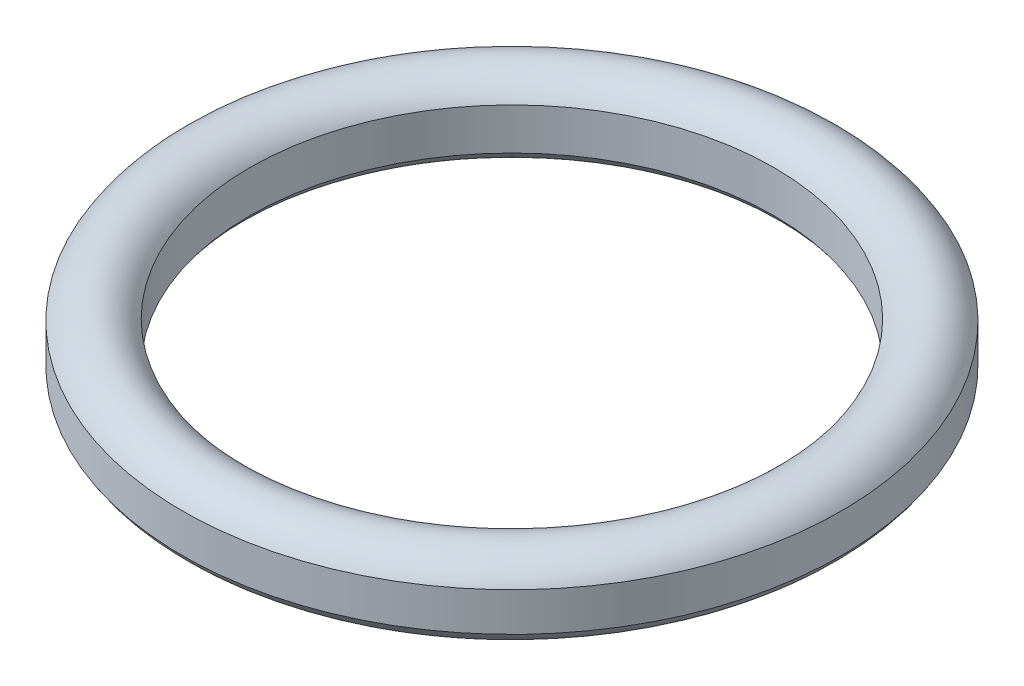
ISO-10303-21;
HEADER;
FILE_DESCRIPTION(('STEP AP214'),'2;1');
FILE_NAME('part.step','',(''),(''),'','','');
FILE_SCHEMA(('AUTOMOTIVE_DESIGN { 1 0 10303 214 1 1 1 1 }'));
ENDSEC;
DATA;
#1=APPLICATION_CONTEXT('core data for automotive mechanical design processes');
#2=APPLICATION_PROTOCOL_DEFINITION('international standard','automotive_design',2000,#1);
#3=PRODUCT_CONTEXT('',#1,'mechanical');
#4=PRODUCT('Part','Part','',(#3));
#5=PRODUCT_RELATED_PRODUCT_CATEGORY('part','',(#4));
#6=PRODUCT_DEFINITION_FORMATION('','',#4);
#7=PRODUCT_DEFINITION_CONTEXT('part definition',#1,'design');
#8=PRODUCT_DEFINITION('design','',#6,#7);
#9=PRODUCT_DEFINITION_SHAPE('','',#8);
#10=(LENGTH_UNIT() NAMED_UNIT(*) SI_UNIT(.MILLI.,.METRE.));
#11=(NAMED_UNIT(*) PLANE_ANGLE_UNIT() SI_UNIT($,.RADIAN.));
#12=(NAMED_UNIT(*) SI_UNIT($,.STERADIAN.) SOLID_ANGLE_UNIT());
#13=UNCERTAINTY_MEASURE_WITH_UNIT(LENGTH_MEASURE(1.E-05),#10,'distance_accuracy_value','');
#14=(GEOMETRIC_REPRESENTATION_CONTEXT(3) GLOBAL_UNCERTAINTY_ASSIGNED_CONTEXT((#13)) GLOBAL_UNIT_ASSIGNED_CONTEXT((#10,
#11,#12)) REPRESENTATION_CONTEXT('',''));
#15=CARTESIAN_POINT('',(0.,0.,0.));
#16=DIRECTION('',(0.,0.,1.));
#17=DIRECTION('',(1.,0.,0.));
#18=AXIS2_PLACEMENT_3D('',#15,#16,#17);
#19=CARTESIAN_POINT('',(0.,0.,0.));
#20=DIRECTION('',(0.,-1.,0.));
#21=DIRECTION('',(0.,0.,-1.));
#22=AXIS2_PLACEMENT_3D('',#19,#20,#21);
#23=CYLINDRICAL_SURFACE('',#22,8.75);
#24=CARTESIAN_POINT('',(0.,0.695701085237044,0.));
#25=DIRECTION('',(0.,-1.,0.));
#26=DIRECTION('',(0.,0.,-1.));
#27=AXIS2_PLACEMENT_3D('',#24,#25,#26);
#28=CIRCLE('',#27,8.75);
#29=CARTESIAN_POINT('',(0.,0.695701085237044,-8.75));
#30=VERTEX_POINT('',#29);
#31=EDGE_CURVE('E10',#30,#30,#28,.T.);
#32=ORIENTED_EDGE('',*,*,#31,.F.);
#33=EDGE_LOOP('',(#32));
#34=FACE_BOUND('',#33,.T.);
#35=CARTESIAN_POINT('',(0.,-0.695701085237044,0.));
#36=DIRECTION('',(0.,-1.,0.));
#37=DIRECTION('',(0.,0.,-1.));
#38=AXIS2_PLACEMENT_3D('',#35,#36,#37);
#39=CIRCLE('',#38,8.75);
#40=CARTESIAN_POINT('',(0.,-0.695701085237044,-8.75));
#41=VERTEX_POINT('',#40);
#42=EDGE_CURVE('E49',#41,#41,#39,.T.);
#43=ORIENTED_EDGE('',*,*,#42,.T.);
#44=EDGE_LOOP('',(#43));
#45=FACE_BOUND('',#44,.T.);
#46=ADVANCED_FACE('F35',(#34,#45),#23,.F.);
#47=CARTESIAN_POINT('',(0.,0.,0.));
#48=DIRECTION('',(0.,-1.,0.));
#49=DIRECTION('',(0.,0.,-1.));
#50=AXIS2_PLACEMENT_3D('',#47,#48,#49);
#51=TOROIDAL_SURFACE('',#50,9.86,1.31);
#52=CARTESIAN_POINT('',(0.,0.645368112010501,0.));
#53=DIRECTION('',(0.,-1.,0.));
#54=DIRECTION('',(0.,0.,-1.));
#55=AXIS2_PLACEMENT_3D('',#52,#53,#54);
#56=CIRCLE('',#55,11.);
#57=CARTESIAN_POINT('',(0.,0.645368112010501,-11.));
#58=VERTEX_POINT('',#57);
#59=EDGE_CURVE('E41',#58,#58,#56,.T.);
#60=ORIENTED_EDGE('',*,*,#59,.F.);
#61=EDGE_LOOP('',(#60));
#62=FACE_BOUND('',#61,.T.);
#63=ORIENTED_EDGE('',*,*,#31,.T.);
#64=EDGE_LOOP('',(#63));
#65=FACE_BOUND('',#64,.T.);
#66=ADVANCED_FACE('F61',(#62,#65),#51,.T.);
#67=CARTESIAN_POINT('',(0.,0.,0.));
#68=DIRECTION('',(0.,-1.,0.));
#69=DIRECTION('',(0.,0.,-1.));
#70=AXIS2_PLACEMENT_3D('',#67,#68,#69);
#71=CYLINDRICAL_SURFACE('',#70,11.);
#72=ORIENTED_EDGE('',*,*,#59,.T.);
#73=EDGE_LOOP('',(#72));
#74=FACE_BOUND('',#73,.T.);
#75=CARTESIAN_POINT('',(0.,-0.645368112010501,0.));
#76=DIRECTION('',(0.,-1.,0.));
#77=DIRECTION('',(0.,0.,-1.));
#78=AXIS2_PLACEMENT_3D('',#75,#76,#77);
#79=CIRCLE('',#78,11.);
#80=CARTESIAN_POINT('',(0.,-0.645368112010501,-11.));
#81=VERTEX_POINT('',#80);
#82=EDGE_CURVE('E45',#81,#81,#79,.T.);
#83=ORIENTED_EDGE('',*,*,#82,.F.);
#84=EDGE_LOOP('',(#83));
#85=FACE_BOUND('',#84,.T.);
#86=ADVANCED_FACE('F59',(#74,#85),#71,.T.);
#87=ORIENTED_EDGE('',*,*,#42,.F.);
#88=EDGE_LOOP('',(#87));
#89=FACE_BOUND('',#88,.T.);
#90=ORIENTED_EDGE('',*,*,#82,.T.);
#91=EDGE_LOOP('',(#90));
#92=FACE_BOUND('',#91,.T.);
#93=ADVANCED_FACE('F56',(#89,#92),#51,.T.);
#94=CLOSED_SHELL('',(#46,#66,#86,#93));
#95=MANIFOLD_SOLID_BREP('B2',#94);
#96=ADVANCED_BREP_SHAPE_REPRESENTATION('',(#18,#95),#14);
#97=SHAPE_DEFINITION_REPRESENTATION(#9,#96);
ENDSEC;
END-ISO-10303-21;
